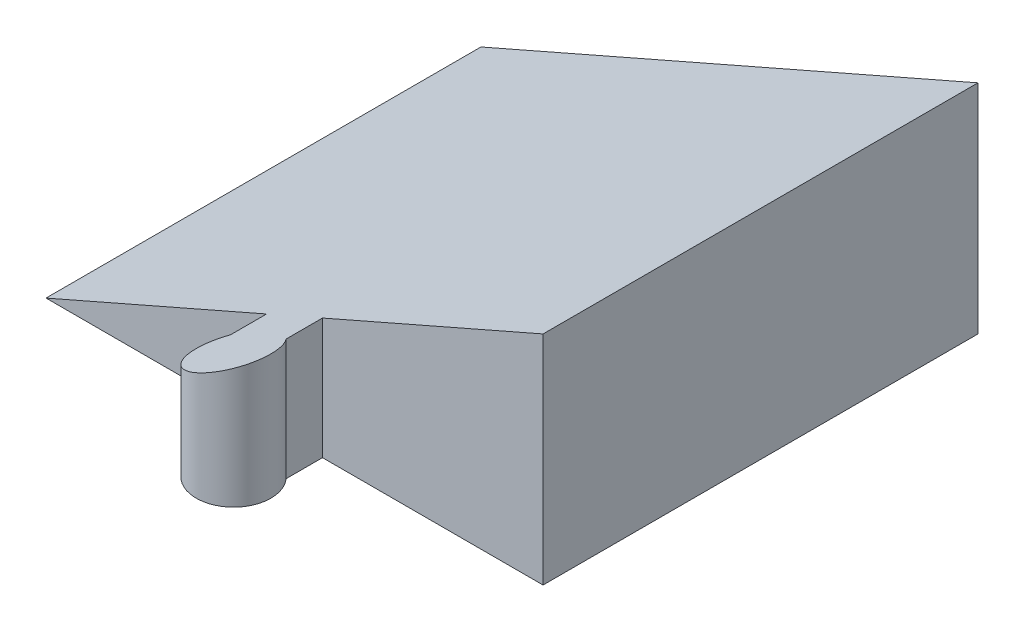
ISO-10303-21;
HEADER;
FILE_DESCRIPTION(('STEP AP214'),'2;1');
FILE_NAME('part.step','',(''),(''),'','','');
FILE_SCHEMA(('AUTOMOTIVE_DESIGN { 1 0 10303 214 1 1 1 1 }'));
ENDSEC;
DATA;
#1=APPLICATION_CONTEXT('core data for automotive mechanical design processes');
#2=APPLICATION_PROTOCOL_DEFINITION('international standard','automotive_design',2000,#1);
#3=PRODUCT_CONTEXT('',#1,'mechanical');
#4=PRODUCT('Part','Part','',(#3));
#5=PRODUCT_RELATED_PRODUCT_CATEGORY('part','',(#4));
#6=PRODUCT_DEFINITION_FORMATION('','',#4);
#7=PRODUCT_DEFINITION_CONTEXT('part definition',#1,'design');
#8=PRODUCT_DEFINITION('design','',#6,#7);
#9=PRODUCT_DEFINITION_SHAPE('','',#8);
#10=(LENGTH_UNIT() NAMED_UNIT(*) SI_UNIT(.MILLI.,.METRE.));
#11=(NAMED_UNIT(*) PLANE_ANGLE_UNIT() SI_UNIT($,.RADIAN.));
#12=(NAMED_UNIT(*) SI_UNIT($,.STERADIAN.) SOLID_ANGLE_UNIT());
#13=UNCERTAINTY_MEASURE_WITH_UNIT(LENGTH_MEASURE(1.E-05),#10,'distance_accuracy_value','');
#14=(GEOMETRIC_REPRESENTATION_CONTEXT(3) GLOBAL_UNCERTAINTY_ASSIGNED_CONTEXT((#13)) GLOBAL_UNIT_ASSIGNED_CONTEXT((#10,
#11,#12)) REPRESENTATION_CONTEXT('',''));
#15=CARTESIAN_POINT('',(0.,0.,0.));
#16=DIRECTION('',(0.,0.,1.));
#17=DIRECTION('',(1.,0.,0.));
#18=AXIS2_PLACEMENT_3D('',#15,#16,#17);
#19=CARTESIAN_POINT('',(0.,0.,70.));
#20=DIRECTION('',(0.,0.,1.));
#21=DIRECTION('',(1.,0.,0.));
#22=AXIS2_PLACEMENT_3D('',#19,#20,#21);
#23=PLANE('',#22);
#24=DIRECTION('',(-0.916157334902189,-0.400818834019708,0.));
#25=VECTOR('',#24,1.);
#26=CARTESIAN_POINT('',(-46.1666666666667,-15.6527777777778,70.));
#27=LINE('',#26,#25);
#28=CARTESIAN_POINT('',(33.8333333333333,19.3472222222222,70.));
#29=VERTEX_POINT('',#28);
#30=CARTESIAN_POINT('',(-1.66666666666668,3.81597222222222,70.));
#31=VERTEX_POINT('',#30);
#32=EDGE_CURVE('E146',#29,#31,#27,.T.);
#33=ORIENTED_EDGE('',*,*,#32,.T.);
#34=DIRECTION('',(0.,-1.,0.));
#35=VECTOR('',#34,1.);
#36=CARTESIAN_POINT('',(-1.66666666666667,22.6081927879704,70.));
#37=LINE('',#36,#35);
#38=CARTESIAN_POINT('',(-1.66666666666667,-15.6527777777778,70.));
#39=VERTEX_POINT('',#38);
#40=EDGE_CURVE('E55',#31,#39,#37,.T.);
#41=ORIENTED_EDGE('',*,*,#40,.T.);
#42=DIRECTION('',(1.,0.,0.));
#43=VECTOR('',#42,1.);
#44=CARTESIAN_POINT('',(-46.1666666666667,-15.6527777777778,70.));
#45=LINE('',#44,#43);
#46=CARTESIAN_POINT('',(33.8333333333333,-15.6527777777778,70.));
#47=VERTEX_POINT('',#46);
#48=EDGE_CURVE('E106',#39,#47,#45,.T.);
#49=ORIENTED_EDGE('',*,*,#48,.T.);
#50=DIRECTION('',(0.,1.,0.));
#51=VECTOR('',#50,1.);
#52=CARTESIAN_POINT('',(33.8333333333333,19.3472222222222,70.));
#53=LINE('',#52,#51);
#54=EDGE_CURVE('E141',#47,#29,#53,.T.);
#55=ORIENTED_EDGE('',*,*,#54,.T.);
#56=EDGE_LOOP('',(#33,#41,#49,#55));
#57=FACE_BOUND('',#56,.T.);
#58=ADVANCED_FACE('F39',(#57),#23,.T.);
#59=CARTESIAN_POINT('',(33.8333333333333,19.3472222222222,70.));
#60=DIRECTION('',(-1.,0.,0.));
#61=DIRECTION('',(0.,0.,1.));
#62=AXIS2_PLACEMENT_3D('',#59,#60,#61);
#63=PLANE('',#62);
#64=DIRECTION('',(0.,1.,0.));
#65=VECTOR('',#64,1.);
#66=CARTESIAN_POINT('',(33.8333333333333,19.3472222222222,0.));
#67=LINE('',#66,#65);
#68=CARTESIAN_POINT('',(33.8333333333333,-15.6527777777778,0.));
#69=VERTEX_POINT('',#68);
#70=CARTESIAN_POINT('',(33.8333333333333,19.3472222222222,0.));
#71=VERTEX_POINT('',#70);
#72=EDGE_CURVE('E149',#69,#71,#67,.T.);
#73=ORIENTED_EDGE('',*,*,#72,.T.);
#74=DIRECTION('',(0.,0.,-1.));
#75=VECTOR('',#74,1.);
#76=CARTESIAN_POINT('',(33.8333333333333,19.3472222222222,70.));
#77=LINE('',#76,#75);
#78=EDGE_CURVE('E11',#29,#71,#77,.T.);
#79=ORIENTED_EDGE('',*,*,#78,.F.);
#80=ORIENTED_EDGE('',*,*,#54,.F.);
#81=DIRECTION('',(0.,0.,-1.));
#82=VECTOR('',#81,1.);
#83=CARTESIAN_POINT('',(33.8333333333333,-15.6527777777778,70.));
#84=LINE('',#83,#82);
#85=EDGE_CURVE('E105',#47,#69,#84,.T.);
#86=ORIENTED_EDGE('',*,*,#85,.T.);
#87=EDGE_LOOP('',(#73,#79,#80,#86));
#88=FACE_BOUND('',#87,.T.);
#89=ADVANCED_FACE('F41',(#88),#63,.F.);
#90=CARTESIAN_POINT('',(-46.1666666666667,-15.6527777777778,70.));
#91=DIRECTION('',(0.400818834019708,-0.916157334902189,0.));
#92=DIRECTION('',(0.916157334902189,0.400818834019708,0.));
#93=AXIS2_PLACEMENT_3D('',#90,#91,#92);
#94=PLANE('',#93);
#95=DIRECTION('',(-0.916157334902189,-0.400818834019708,0.));
#96=VECTOR('',#95,1.);
#97=CARTESIAN_POINT('',(-46.1666666666667,-15.6527777777778,0.));
#98=LINE('',#97,#96);
#99=CARTESIAN_POINT('',(-46.1666666666667,-15.6527777777778,0.));
#100=VERTEX_POINT('',#99);
#101=EDGE_CURVE('E153',#71,#100,#98,.T.);
#102=ORIENTED_EDGE('',*,*,#101,.T.);
#103=DIRECTION('',(0.,0.,-1.));
#104=VECTOR('',#103,1.);
#105=CARTESIAN_POINT('',(-46.1666666666667,-15.6527777777778,70.));
#106=LINE('',#105,#104);
#107=CARTESIAN_POINT('',(-46.1666666666667,-15.6527777777778,70.));
#108=VERTEX_POINT('',#107);
#109=EDGE_CURVE('E48',#108,#100,#106,.T.);
#110=ORIENTED_EDGE('',*,*,#109,.F.);
#111=CARTESIAN_POINT('',(-10.6666666666667,-0.121527777777776,70.));
#112=VERTEX_POINT('',#111);
#113=EDGE_CURVE('E99',#112,#108,#27,.T.);
#114=ORIENTED_EDGE('',*,*,#113,.F.);
#115=DIRECTION('',(0.,0.,1.));
#116=VECTOR('',#115,1.);
#117=CARTESIAN_POINT('',(-10.6666666666667,-0.121527777777776,70.));
#118=LINE('',#117,#116);
#119=CARTESIAN_POINT('',(-10.6666666666667,-0.121527777777776,75.846688068541));
#120=VERTEX_POINT('',#119);
#121=EDGE_CURVE('E115',#112,#120,#118,.T.);
#122=ORIENTED_EDGE('',*,*,#121,.T.);
#123=CARTESIAN_POINT('',(-6.16666666666667,1.84722222222222,79.8153150351379));
#124=DIRECTION('',(0.400818834019708,-0.916157334902189,0.));
#125=DIRECTION('',(-0.916157334902189,-0.400818834019708,0.));
#126=AXIS2_PLACEMENT_3D('',#123,#124,#125);
#127=ELLIPSE('',#126,6.54909344871487,6.);
#128=CARTESIAN_POINT('',(-1.66666666666667,3.81597222222222,75.846688068541));
#129=VERTEX_POINT('',#128);
#130=EDGE_CURVE('E180',#120,#129,#127,.F.);
#131=ORIENTED_EDGE('',*,*,#130,.T.);
#132=DIRECTION('',(0.,0.,-1.));
#133=VECTOR('',#132,1.);
#134=CARTESIAN_POINT('',(-1.66666666666667,3.81597222222222,70.));
#135=LINE('',#134,#133);
#136=EDGE_CURVE('E135',#129,#31,#135,.T.);
#137=ORIENTED_EDGE('',*,*,#136,.T.);
#138=ORIENTED_EDGE('',*,*,#32,.F.);
#139=ORIENTED_EDGE('',*,*,#78,.T.);
#140=EDGE_LOOP('',(#102,#110,#114,#122,#131,#137,#138,#139));
#141=FACE_BOUND('',#140,.T.);
#142=ADVANCED_FACE('F185',(#141),#94,.F.);
#143=CARTESIAN_POINT('',(-46.1666666666667,-15.6527777777778,70.));
#144=DIRECTION('',(0.,1.,0.));
#145=DIRECTION('',(0.,0.,1.));
#146=AXIS2_PLACEMENT_3D('',#143,#144,#145);
#147=PLANE('',#146);
#148=DIRECTION('',(1.,0.,0.));
#149=VECTOR('',#148,1.);
#150=CARTESIAN_POINT('',(-46.1666666666667,-15.6527777777778,0.));
#151=LINE('',#150,#149);
#152=EDGE_CURVE('E145',#100,#69,#151,.T.);
#153=ORIENTED_EDGE('',*,*,#152,.T.);
#154=ORIENTED_EDGE('',*,*,#85,.F.);
#155=ORIENTED_EDGE('',*,*,#48,.F.);
#156=DIRECTION('',(0.,0.,1.));
#157=VECTOR('',#156,1.);
#158=CARTESIAN_POINT('',(-1.66666666666667,-15.6527777777778,70.));
#159=LINE('',#158,#157);
#160=CARTESIAN_POINT('',(-1.66666666666667,-15.6527777777778,75.846688068541));
#161=VERTEX_POINT('',#160);
#162=EDGE_CURVE('E123',#39,#161,#159,.T.);
#163=ORIENTED_EDGE('',*,*,#162,.T.);
#164=CARTESIAN_POINT('',(-6.16666666666667,-15.6527777777778,79.8153150351379));
#165=DIRECTION('',(0.,-1.,0.));
#166=DIRECTION('',(0.,0.,-1.));
#167=AXIS2_PLACEMENT_3D('',#164,#165,#166);
#168=CIRCLE('',#167,6.);
#169=CARTESIAN_POINT('',(-10.6666666666667,-15.6527777777778,75.846688068541));
#170=VERTEX_POINT('',#169);
#171=EDGE_CURVE('E117',#161,#170,#168,.T.);
#172=ORIENTED_EDGE('',*,*,#171,.T.);
#173=DIRECTION('',(0.,0.,-1.));
#174=VECTOR('',#173,1.);
#175=CARTESIAN_POINT('',(-10.6666666666667,-15.6527777777778,70.));
#176=LINE('',#175,#174);
#177=CARTESIAN_POINT('',(-10.6666666666667,-15.6527777777778,70.));
#178=VERTEX_POINT('',#177);
#179=EDGE_CURVE('E113',#170,#178,#176,.T.);
#180=ORIENTED_EDGE('',*,*,#179,.T.);
#181=EDGE_CURVE('E97',#108,#178,#45,.T.);
#182=ORIENTED_EDGE('',*,*,#181,.F.);
#183=ORIENTED_EDGE('',*,*,#109,.T.);
#184=EDGE_LOOP('',(#153,#154,#155,#163,#172,#180,#182,#183));
#185=FACE_BOUND('',#184,.T.);
#186=ADVANCED_FACE('F119',(#185),#147,.F.);
#187=DIRECTION('',(0.,-1.,0.));
#188=VECTOR('',#187,1.);
#189=CARTESIAN_POINT('',(-10.6666666666667,22.6081927879704,70.));
#190=LINE('',#189,#188);
#191=EDGE_CURVE('E63',#112,#178,#190,.T.);
#192=ORIENTED_EDGE('',*,*,#191,.F.);
#193=ORIENTED_EDGE('',*,*,#113,.T.);
#194=ORIENTED_EDGE('',*,*,#181,.T.);
#195=EDGE_LOOP('',(#192,#193,#194));
#196=FACE_BOUND('',#195,.T.);
#197=ADVANCED_FACE('F98',(#196),#23,.T.);
#198=CARTESIAN_POINT('',(0.,0.,0.));
#199=DIRECTION('',(0.,0.,1.));
#200=DIRECTION('',(1.,0.,0.));
#201=AXIS2_PLACEMENT_3D('',#198,#199,#200);
#202=PLANE('',#201);
#203=ORIENTED_EDGE('',*,*,#72,.F.);
#204=ORIENTED_EDGE('',*,*,#152,.F.);
#205=ORIENTED_EDGE('',*,*,#101,.F.);
#206=EDGE_LOOP('',(#203,#204,#205));
#207=FACE_BOUND('',#206,.T.);
#208=ADVANCED_FACE('F166',(#207),#202,.F.);
#209=CARTESIAN_POINT('',(-10.6666666666667,22.6081927879704,70.));
#210=DIRECTION('',(-1.,0.,0.));
#211=DIRECTION('',(0.,0.,1.));
#212=AXIS2_PLACEMENT_3D('',#209,#210,#211);
#213=PLANE('',#212);
#214=ORIENTED_EDGE('',*,*,#121,.F.);
#215=ORIENTED_EDGE('',*,*,#191,.T.);
#216=ORIENTED_EDGE('',*,*,#179,.F.);
#217=DIRECTION('',(0.,-1.,0.));
#218=VECTOR('',#217,1.);
#219=CARTESIAN_POINT('',(-10.6666666666667,22.6081927879704,75.846688068541));
#220=LINE('',#219,#218);
#221=EDGE_CURVE('E132',#120,#170,#220,.T.);
#222=ORIENTED_EDGE('',*,*,#221,.F.);
#223=EDGE_LOOP('',(#214,#215,#216,#222));
#224=FACE_BOUND('',#223,.T.);
#225=ADVANCED_FACE('F111',(#224),#213,.T.);
#226=CARTESIAN_POINT('',(-6.16666666666667,22.6081927879704,79.8153150351379));
#227=DIRECTION('',(0.,-1.,0.));
#228=DIRECTION('',(0.,0.,-1.));
#229=AXIS2_PLACEMENT_3D('',#226,#227,#228);
#230=CYLINDRICAL_SURFACE('',#229,6.);
#231=ORIENTED_EDGE('',*,*,#130,.F.);
#232=ORIENTED_EDGE('',*,*,#221,.T.);
#233=ORIENTED_EDGE('',*,*,#171,.F.);
#234=DIRECTION('',(0.,-1.,0.));
#235=VECTOR('',#234,1.);
#236=CARTESIAN_POINT('',(-1.66666666666667,22.6081927879704,75.846688068541));
#237=LINE('',#236,#235);
#238=EDGE_CURVE('E136',#129,#161,#237,.T.);
#239=ORIENTED_EDGE('',*,*,#238,.F.);
#240=EDGE_LOOP('',(#231,#232,#233,#239));
#241=FACE_BOUND('',#240,.T.);
#242=ADVANCED_FACE('F179',(#241),#230,.T.);
#243=CARTESIAN_POINT('',(-1.66666666666667,22.6081927879704,70.));
#244=DIRECTION('',(1.,0.,0.));
#245=DIRECTION('',(0.,0.,-1.));
#246=AXIS2_PLACEMENT_3D('',#243,#244,#245);
#247=PLANE('',#246);
#248=ORIENTED_EDGE('',*,*,#136,.F.);
#249=ORIENTED_EDGE('',*,*,#238,.T.);
#250=ORIENTED_EDGE('',*,*,#162,.F.);
#251=ORIENTED_EDGE('',*,*,#40,.F.);
#252=EDGE_LOOP('',(#248,#249,#250,#251));
#253=FACE_BOUND('',#252,.T.);
#254=ADVANCED_FACE('F174',(#253),#247,.T.);
#255=CLOSED_SHELL('',(#58,#89,#142,#186,#197,#208,#225,#242,#254));
#256=MANIFOLD_SOLID_BREP('B2',#255);
#257=ADVANCED_BREP_SHAPE_REPRESENTATION('',(#18,#256),#14);
#258=SHAPE_DEFINITION_REPRESENTATION(#9,#257);
ENDSEC;
END-ISO-10303-21;
